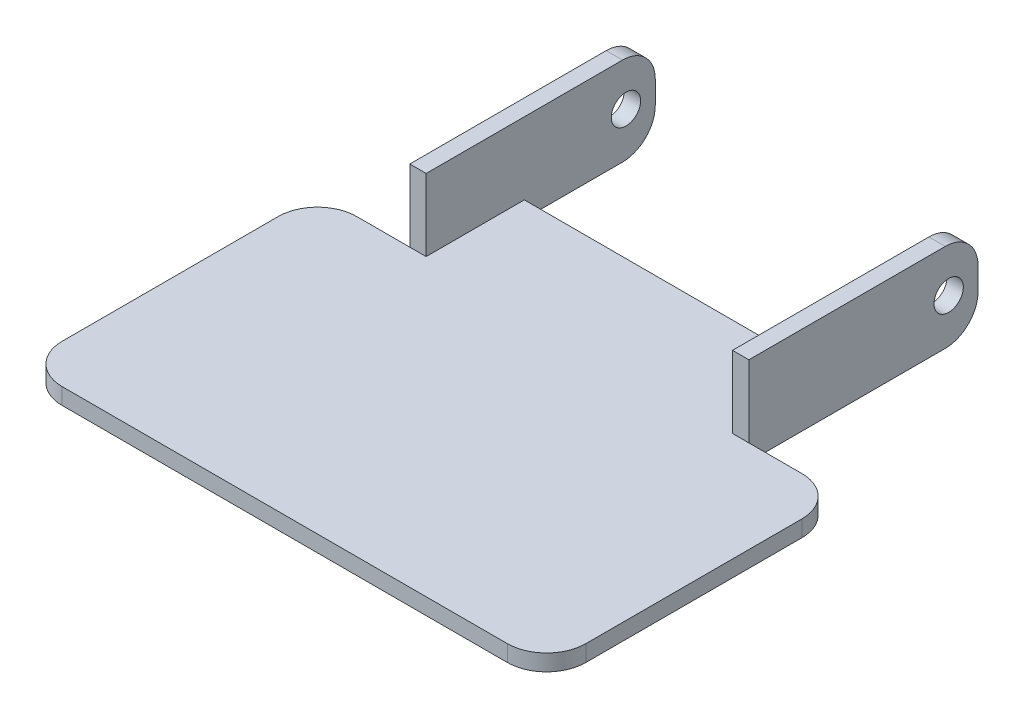
ISO-10303-21;
HEADER;
FILE_DESCRIPTION(('STEP AP214'),'2;1');
FILE_NAME('part.step','',(''),(''),'','','');
FILE_SCHEMA(('AUTOMOTIVE_DESIGN { 1 0 10303 214 1 1 1 1 }'));
ENDSEC;
DATA;
#1=APPLICATION_CONTEXT('core data for automotive mechanical design processes');
#2=APPLICATION_PROTOCOL_DEFINITION('international standard','automotive_design',2000,#1);
#3=PRODUCT_CONTEXT('',#1,'mechanical');
#4=PRODUCT('Part','Part','',(#3));
#5=PRODUCT_RELATED_PRODUCT_CATEGORY('part','',(#4));
#6=PRODUCT_DEFINITION_FORMATION('','',#4);
#7=PRODUCT_DEFINITION_CONTEXT('part definition',#1,'design');
#8=PRODUCT_DEFINITION('design','',#6,#7);
#9=PRODUCT_DEFINITION_SHAPE('','',#8);
#10=(LENGTH_UNIT() NAMED_UNIT(*) SI_UNIT(.MILLI.,.METRE.));
#11=(NAMED_UNIT(*) PLANE_ANGLE_UNIT() SI_UNIT($,.RADIAN.));
#12=(NAMED_UNIT(*) SI_UNIT($,.STERADIAN.) SOLID_ANGLE_UNIT());
#13=UNCERTAINTY_MEASURE_WITH_UNIT(LENGTH_MEASURE(1.E-05),#10,'distance_accuracy_value','');
#14=(GEOMETRIC_REPRESENTATION_CONTEXT(3) GLOBAL_UNCERTAINTY_ASSIGNED_CONTEXT((#13)) GLOBAL_UNIT_ASSIGNED_CONTEXT((#10,
#11,#12)) REPRESENTATION_CONTEXT('',''));
#15=CARTESIAN_POINT('',(0.,0.,0.));
#16=DIRECTION('',(0.,0.,1.));
#17=DIRECTION('',(1.,0.,0.));
#18=AXIS2_PLACEMENT_3D('',#15,#16,#17);
#19=CARTESIAN_POINT('',(0.,1.5875,-28.575));
#20=DIRECTION('',(0.,-1.,0.));
#21=DIRECTION('',(0.,0.,-1.));
#22=AXIS2_PLACEMENT_3D('',#19,#20,#21);
#23=PLANE('',#22);
#24=DIRECTION('',(-1.,0.,0.));
#25=VECTOR('',#24,1.);
#26=CARTESIAN_POINT('',(0.,1.5875,-28.575));
#27=LINE('',#26,#25);
#28=CARTESIAN_POINT('',(8.9535,1.5875,-28.575));
#29=VERTEX_POINT('',#28);
#30=CARTESIAN_POINT('',(3.81,1.5875,-28.575));
#31=VERTEX_POINT('',#30);
#32=EDGE_CURVE('E254',#29,#31,#27,.T.);
#33=ORIENTED_EDGE('',*,*,#32,.T.);
#34=CARTESIAN_POINT('',(3.81,1.5875,-24.765));
#35=DIRECTION('',(0.,-1.,0.));
#36=DIRECTION('',(0.,0.,-1.));
#37=AXIS2_PLACEMENT_3D('',#34,#35,#36);
#38=CIRCLE('',#37,3.81);
#39=CARTESIAN_POINT('',(0.,1.5875,-24.765));
#40=VERTEX_POINT('',#39);
#41=EDGE_CURVE('E319',#31,#40,#38,.F.);
#42=ORIENTED_EDGE('',*,*,#41,.T.);
#43=DIRECTION('',(0.,0.,1.));
#44=VECTOR('',#43,1.);
#45=CARTESIAN_POINT('',(0.,1.5875,0.));
#46=LINE('',#45,#44);
#47=CARTESIAN_POINT('',(0.,1.5875,-3.81));
#48=VERTEX_POINT('',#47);
#49=EDGE_CURVE('E245',#40,#48,#46,.T.);
#50=ORIENTED_EDGE('',*,*,#49,.T.);
#51=CARTESIAN_POINT('',(3.81,1.5875,-3.81));
#52=DIRECTION('',(0.,-1.,0.));
#53=DIRECTION('',(0.,0.,-1.));
#54=AXIS2_PLACEMENT_3D('',#51,#52,#53);
#55=CIRCLE('',#54,3.81);
#56=CARTESIAN_POINT('',(3.81,1.5875,0.));
#57=VERTEX_POINT('',#56);
#58=EDGE_CURVE('E317',#48,#57,#55,.F.);
#59=ORIENTED_EDGE('',*,*,#58,.T.);
#60=DIRECTION('',(1.,0.,0.));
#61=VECTOR('',#60,1.);
#62=CARTESIAN_POINT('',(0.,1.5875,0.));
#63=LINE('',#62,#61);
#64=CARTESIAN_POINT('',(46.99,1.5875,0.));
#65=VERTEX_POINT('',#64);
#66=EDGE_CURVE('E489',#57,#65,#63,.T.);
#67=ORIENTED_EDGE('',*,*,#66,.T.);
#68=CARTESIAN_POINT('',(46.99,1.5875,-3.81));
#69=DIRECTION('',(0.,-1.,0.));
#70=DIRECTION('',(0.,0.,-1.));
#71=AXIS2_PLACEMENT_3D('',#68,#69,#70);
#72=CIRCLE('',#71,3.81);
#73=CARTESIAN_POINT('',(50.8,1.5875,-3.81));
#74=VERTEX_POINT('',#73);
#75=EDGE_CURVE('E315',#65,#74,#72,.F.);
#76=ORIENTED_EDGE('',*,*,#75,.T.);
#77=DIRECTION('',(0.,0.,-1.));
#78=VECTOR('',#77,1.);
#79=CARTESIAN_POINT('',(50.8,1.5875,0.));
#80=LINE('',#79,#78);
#81=CARTESIAN_POINT('',(50.8,1.5875,-24.765));
#82=VERTEX_POINT('',#81);
#83=EDGE_CURVE('E331',#74,#82,#80,.T.);
#84=ORIENTED_EDGE('',*,*,#83,.T.);
#85=CARTESIAN_POINT('',(46.99,1.5875,-24.765));
#86=DIRECTION('',(0.,-1.,0.));
#87=DIRECTION('',(0.,0.,-1.));
#88=AXIS2_PLACEMENT_3D('',#85,#86,#87);
#89=CIRCLE('',#88,3.81);
#90=CARTESIAN_POINT('',(46.99,1.5875,-28.575));
#91=VERTEX_POINT('',#90);
#92=EDGE_CURVE('E48',#82,#91,#89,.F.);
#93=ORIENTED_EDGE('',*,*,#92,.T.);
#94=DIRECTION('',(-1.,0.,0.));
#95=VECTOR('',#94,1.);
#96=CARTESIAN_POINT('',(41.8465,1.5875,-28.575));
#97=LINE('',#96,#95);
#98=CARTESIAN_POINT('',(41.8465,1.5875,-28.575));
#99=VERTEX_POINT('',#98);
#100=EDGE_CURVE('E255',#91,#99,#97,.T.);
#101=ORIENTED_EDGE('',*,*,#100,.T.);
#102=DIRECTION('',(1.,0.,0.));
#103=VECTOR('',#102,1.);
#104=CARTESIAN_POINT('',(41.8465,1.5875,-28.575));
#105=LINE('',#104,#103);
#106=CARTESIAN_POINT('',(40.259,1.5875,-28.575));
#107=VERTEX_POINT('',#106);
#108=EDGE_CURVE('E222',#107,#99,#105,.T.);
#109=ORIENTED_EDGE('',*,*,#108,.F.);
#110=DIRECTION('',(0.,0.,1.));
#111=VECTOR('',#110,1.);
#112=CARTESIAN_POINT('',(40.259,1.5875,-28.575));
#113=LINE('',#112,#111);
#114=CARTESIAN_POINT('',(40.259,1.5875,-38.1));
#115=VERTEX_POINT('',#114);
#116=EDGE_CURVE('E208',#115,#107,#113,.T.);
#117=ORIENTED_EDGE('',*,*,#116,.F.);
#118=DIRECTION('',(-1.,0.,0.));
#119=VECTOR('',#118,1.);
#120=CARTESIAN_POINT('',(10.541,1.5875,-38.1));
#121=LINE('',#120,#119);
#122=CARTESIAN_POINT('',(10.541,1.5875,-38.1));
#123=VERTEX_POINT('',#122);
#124=EDGE_CURVE('E252',#115,#123,#121,.T.);
#125=ORIENTED_EDGE('',*,*,#124,.T.);
#126=DIRECTION('',(0.,0.,-1.));
#127=VECTOR('',#126,1.);
#128=CARTESIAN_POINT('',(10.541,1.5875,-28.575));
#129=LINE('',#128,#127);
#130=CARTESIAN_POINT('',(10.541,1.5875,-28.575));
#131=VERTEX_POINT('',#130);
#132=EDGE_CURVE('E228',#131,#123,#129,.T.);
#133=ORIENTED_EDGE('',*,*,#132,.F.);
#134=DIRECTION('',(1.,0.,0.));
#135=VECTOR('',#134,1.);
#136=CARTESIAN_POINT('',(8.9535,1.5875,-28.575));
#137=LINE('',#136,#135);
#138=EDGE_CURVE('E211',#29,#131,#137,.T.);
#139=ORIENTED_EDGE('',*,*,#138,.F.);
#140=EDGE_LOOP('',(#33,#42,#50,#59,#67,#76,#84,#93,#101,#109,#117,#125,#133,#139));
#141=FACE_BOUND('',#140,.T.);
#142=ADVANCED_FACE('F33',(#141),#23,.F.);
#143=CARTESIAN_POINT('',(0.,1.5875,0.));
#144=DIRECTION('',(1.,0.,0.));
#145=DIRECTION('',(0.,0.,-1.));
#146=AXIS2_PLACEMENT_3D('',#143,#144,#145);
#147=PLANE('',#146);
#148=ORIENTED_EDGE('',*,*,#49,.F.);
#149=DIRECTION('',(0.,-1.,0.));
#150=VECTOR('',#149,1.);
#151=CARTESIAN_POINT('',(0.,1.5875,-24.765));
#152=LINE('',#151,#150);
#153=CARTESIAN_POINT('',(0.,0.,-24.765));
#154=VERTEX_POINT('',#153);
#155=EDGE_CURVE('E301',#40,#154,#152,.T.);
#156=ORIENTED_EDGE('',*,*,#155,.T.);
#157=DIRECTION('',(0.,0.,1.));
#158=VECTOR('',#157,1.);
#159=CARTESIAN_POINT('',(0.,0.,0.));
#160=LINE('',#159,#158);
#161=CARTESIAN_POINT('',(0.,0.,-3.81));
#162=VERTEX_POINT('',#161);
#163=EDGE_CURVE('E241',#154,#162,#160,.T.);
#164=ORIENTED_EDGE('',*,*,#163,.T.);
#165=DIRECTION('',(0.,-1.,0.));
#166=VECTOR('',#165,1.);
#167=CARTESIAN_POINT('',(0.,1.5875,-3.81));
#168=LINE('',#167,#166);
#169=EDGE_CURVE('E299',#162,#48,#168,.F.);
#170=ORIENTED_EDGE('',*,*,#169,.T.);
#171=EDGE_LOOP('',(#148,#156,#164,#170));
#172=FACE_BOUND('',#171,.T.);
#173=ADVANCED_FACE('F410',(#172),#147,.F.);
#174=CARTESIAN_POINT('',(0.,1.5875,0.));
#175=DIRECTION('',(0.,0.,-1.));
#176=DIRECTION('',(-1.,0.,0.));
#177=AXIS2_PLACEMENT_3D('',#174,#175,#176);
#178=PLANE('',#177);
#179=ORIENTED_EDGE('',*,*,#66,.F.);
#180=DIRECTION('',(0.,-1.,0.));
#181=VECTOR('',#180,1.);
#182=CARTESIAN_POINT('',(3.81,1.5875,0.));
#183=LINE('',#182,#181);
#184=CARTESIAN_POINT('',(3.81,0.,0.));
#185=VERTEX_POINT('',#184);
#186=EDGE_CURVE('E323',#57,#185,#183,.T.);
#187=ORIENTED_EDGE('',*,*,#186,.T.);
#188=DIRECTION('',(1.,0.,0.));
#189=VECTOR('',#188,1.);
#190=CARTESIAN_POINT('',(0.,0.,0.));
#191=LINE('',#190,#189);
#192=CARTESIAN_POINT('',(46.99,0.,0.));
#193=VERTEX_POINT('',#192);
#194=EDGE_CURVE('E341',#185,#193,#191,.T.);
#195=ORIENTED_EDGE('',*,*,#194,.T.);
#196=DIRECTION('',(0.,-1.,0.));
#197=VECTOR('',#196,1.);
#198=CARTESIAN_POINT('',(46.99,1.5875,0.));
#199=LINE('',#198,#197);
#200=EDGE_CURVE('E321',#193,#65,#199,.F.);
#201=ORIENTED_EDGE('',*,*,#200,.T.);
#202=EDGE_LOOP('',(#179,#187,#195,#201));
#203=FACE_BOUND('',#202,.T.);
#204=ADVANCED_FACE('F415',(#203),#178,.F.);
#205=CARTESIAN_POINT('',(50.8,1.5875,0.));
#206=DIRECTION('',(-1.,0.,0.));
#207=DIRECTION('',(0.,0.,1.));
#208=AXIS2_PLACEMENT_3D('',#205,#206,#207);
#209=PLANE('',#208);
#210=ORIENTED_EDGE('',*,*,#83,.F.);
#211=DIRECTION('',(0.,-1.,0.));
#212=VECTOR('',#211,1.);
#213=CARTESIAN_POINT('',(50.8,1.5875,-3.81));
#214=LINE('',#213,#212);
#215=CARTESIAN_POINT('',(50.8,0.,-3.81));
#216=VERTEX_POINT('',#215);
#217=EDGE_CURVE('E41',#74,#216,#214,.T.);
#218=ORIENTED_EDGE('',*,*,#217,.T.);
#219=DIRECTION('',(0.,0.,-1.));
#220=VECTOR('',#219,1.);
#221=CARTESIAN_POINT('',(50.8,0.,0.));
#222=LINE('',#221,#220);
#223=CARTESIAN_POINT('',(50.8,0.,-24.765));
#224=VERTEX_POINT('',#223);
#225=EDGE_CURVE('E330',#216,#224,#222,.T.);
#226=ORIENTED_EDGE('',*,*,#225,.T.);
#227=DIRECTION('',(0.,-1.,0.));
#228=VECTOR('',#227,1.);
#229=CARTESIAN_POINT('',(50.8,1.5875,-24.765));
#230=LINE('',#229,#228);
#231=EDGE_CURVE('E56',#224,#82,#230,.F.);
#232=ORIENTED_EDGE('',*,*,#231,.T.);
#233=EDGE_LOOP('',(#210,#218,#226,#232));
#234=FACE_BOUND('',#233,.T.);
#235=ADVANCED_FACE('F329',(#234),#209,.F.);
#236=CARTESIAN_POINT('',(41.8465,1.5875,-28.575));
#237=DIRECTION('',(0.,0.,1.));
#238=DIRECTION('',(1.,0.,0.));
#239=AXIS2_PLACEMENT_3D('',#236,#237,#238);
#240=PLANE('',#239);
#241=ORIENTED_EDGE('',*,*,#100,.F.);
#242=DIRECTION('',(0.,-1.,0.));
#243=VECTOR('',#242,1.);
#244=CARTESIAN_POINT('',(46.99,1.5875,-28.575));
#245=LINE('',#244,#243);
#246=CARTESIAN_POINT('',(46.99,0.,-28.575));
#247=VERTEX_POINT('',#246);
#248=EDGE_CURVE('E11',#91,#247,#245,.T.);
#249=ORIENTED_EDGE('',*,*,#248,.T.);
#250=DIRECTION('',(-1.,0.,0.));
#251=VECTOR('',#250,1.);
#252=CARTESIAN_POINT('',(41.8465,0.,-28.575));
#253=LINE('',#252,#251);
#254=CARTESIAN_POINT('',(41.8465,0.,-28.575));
#255=VERTEX_POINT('',#254);
#256=EDGE_CURVE('E340',#247,#255,#253,.T.);
#257=ORIENTED_EDGE('',*,*,#256,.T.);
#258=DIRECTION('',(0.,-1.,0.));
#259=VECTOR('',#258,1.);
#260=CARTESIAN_POINT('',(41.8465,1.5875,-28.575));
#261=LINE('',#260,#259);
#262=EDGE_CURVE('E250',#99,#255,#261,.T.);
#263=ORIENTED_EDGE('',*,*,#262,.F.);
#264=EDGE_LOOP('',(#241,#249,#257,#263));
#265=FACE_BOUND('',#264,.T.);
#266=ADVANCED_FACE('F406',(#265),#240,.F.);
#267=CARTESIAN_POINT('',(41.8465,1.5875,-50.8));
#268=DIRECTION('',(-1.,0.,0.));
#269=DIRECTION('',(0.,0.,1.));
#270=AXIS2_PLACEMENT_3D('',#267,#268,#269);
#271=PLANE('',#270);
#272=CARTESIAN_POINT('',(41.8465,4.28625,-47.9552));
#273=DIRECTION('',(-1.,0.,0.));
#274=DIRECTION('',(0.,0.,1.));
#275=AXIS2_PLACEMENT_3D('',#272,#273,#274);
#276=CIRCLE('',#275,1.42240000000001);
#277=CARTESIAN_POINT('',(41.8465,4.28625,-46.5328));
#278=VERTEX_POINT('',#277);
#279=EDGE_CURVE('E713',#278,#278,#276,.T.);
#280=ORIENTED_EDGE('',*,*,#279,.T.);
#281=EDGE_LOOP('',(#280));
#282=FACE_BOUND('',#281,.T.);
#283=DIRECTION('',(0.,-1.,0.));
#284=VECTOR('',#283,1.);
#285=CARTESIAN_POINT('',(41.8465,1.5875,-50.8));
#286=LINE('',#285,#284);
#287=CARTESIAN_POINT('',(41.8465,5.3975,-50.8));
#288=VERTEX_POINT('',#287);
#289=CARTESIAN_POINT('',(41.8465,3.175,-50.8));
#290=VERTEX_POINT('',#289);
#291=EDGE_CURVE('E374',#288,#290,#286,.T.);
#292=ORIENTED_EDGE('',*,*,#291,.F.);
#293=CARTESIAN_POINT('',(41.8465,5.3975,-47.625));
#294=DIRECTION('',(-1.,0.,0.));
#295=DIRECTION('',(0.,0.,1.));
#296=AXIS2_PLACEMENT_3D('',#293,#294,#295);
#297=CIRCLE('',#296,3.175);
#298=CARTESIAN_POINT('',(41.8465,8.5725,-47.625));
#299=VERTEX_POINT('',#298);
#300=EDGE_CURVE('E277',#288,#299,#297,.F.);
#301=ORIENTED_EDGE('',*,*,#300,.T.);
#302=DIRECTION('',(0.,0.,-1.));
#303=VECTOR('',#302,1.);
#304=CARTESIAN_POINT('',(41.8465,8.5725,-28.575));
#305=LINE('',#304,#303);
#306=CARTESIAN_POINT('',(41.8465,8.5725,-28.575));
#307=VERTEX_POINT('',#306);
#308=EDGE_CURVE('E200',#307,#299,#305,.T.);
#309=ORIENTED_EDGE('',*,*,#308,.F.);
#310=DIRECTION('',(0.,-1.,0.));
#311=VECTOR('',#310,1.);
#312=CARTESIAN_POINT('',(41.8465,8.5725,-28.575));
#313=LINE('',#312,#311);
#314=EDGE_CURVE('E212',#307,#99,#313,.T.);
#315=ORIENTED_EDGE('',*,*,#314,.T.);
#316=ORIENTED_EDGE('',*,*,#262,.T.);
#317=DIRECTION('',(0.,0.,-1.));
#318=VECTOR('',#317,1.);
#319=CARTESIAN_POINT('',(41.8465,0.,-50.8));
#320=LINE('',#319,#318);
#321=CARTESIAN_POINT('',(41.8465,0.,-47.625));
#322=VERTEX_POINT('',#321);
#323=EDGE_CURVE('E343',#255,#322,#320,.T.);
#324=ORIENTED_EDGE('',*,*,#323,.T.);
#325=CARTESIAN_POINT('',(41.8465,3.175,-47.625));
#326=DIRECTION('',(-1.,0.,0.));
#327=DIRECTION('',(0.,0.,1.));
#328=AXIS2_PLACEMENT_3D('',#325,#326,#327);
#329=CIRCLE('',#328,3.175);
#330=EDGE_CURVE('E275',#322,#290,#329,.F.);
#331=ORIENTED_EDGE('',*,*,#330,.T.);
#332=EDGE_LOOP('',(#292,#301,#309,#315,#316,#324,#331));
#333=FACE_BOUND('',#332,.T.);
#334=ADVANCED_FACE('F383',(#282,#333),#271,.F.);
#335=CARTESIAN_POINT('',(40.259,1.5875,-50.8));
#336=DIRECTION('',(0.,0.,1.));
#337=DIRECTION('',(1.,0.,0.));
#338=AXIS2_PLACEMENT_3D('',#335,#336,#337);
#339=PLANE('',#338);
#340=DIRECTION('',(0.,-1.,0.));
#341=VECTOR('',#340,1.);
#342=CARTESIAN_POINT('',(40.259,1.5875,-50.8));
#343=LINE('',#342,#341);
#344=CARTESIAN_POINT('',(40.259,5.3975,-50.8));
#345=VERTEX_POINT('',#344);
#346=CARTESIAN_POINT('',(40.259,3.175,-50.8));
#347=VERTEX_POINT('',#346);
#348=EDGE_CURVE('E372',#345,#347,#343,.T.);
#349=ORIENTED_EDGE('',*,*,#348,.F.);
#350=DIRECTION('',(-1.,0.,0.));
#351=VECTOR('',#350,1.);
#352=CARTESIAN_POINT('',(41.8465,5.3975,-50.8));
#353=LINE('',#352,#351);
#354=EDGE_CURVE('E273',#345,#288,#353,.F.);
#355=ORIENTED_EDGE('',*,*,#354,.T.);
#356=ORIENTED_EDGE('',*,*,#291,.T.);
#357=DIRECTION('',(-1.,0.,0.));
#358=VECTOR('',#357,1.);
#359=CARTESIAN_POINT('',(40.259,3.175,-50.8));
#360=LINE('',#359,#358);
#361=EDGE_CURVE('E270',#290,#347,#360,.T.);
#362=ORIENTED_EDGE('',*,*,#361,.T.);
#363=EDGE_LOOP('',(#349,#355,#356,#362));
#364=FACE_BOUND('',#363,.T.);
#365=ADVANCED_FACE('F396',(#364),#339,.F.);
#366=CARTESIAN_POINT('',(40.259,1.5875,-38.1));
#367=DIRECTION('',(1.,0.,0.));
#368=DIRECTION('',(0.,0.,-1.));
#369=AXIS2_PLACEMENT_3D('',#366,#367,#368);
#370=PLANE('',#369);
#371=CARTESIAN_POINT('',(40.259,4.28625,-47.9552));
#372=DIRECTION('',(1.,0.,0.));
#373=DIRECTION('',(0.,0.,-1.));
#374=AXIS2_PLACEMENT_3D('',#371,#372,#373);
#375=CIRCLE('',#374,1.42240000000001);
#376=CARTESIAN_POINT('',(40.259,4.28625,-49.3776));
#377=VERTEX_POINT('',#376);
#378=EDGE_CURVE('E223',#377,#377,#375,.T.);
#379=ORIENTED_EDGE('',*,*,#378,.T.);
#380=EDGE_LOOP('',(#379));
#381=FACE_BOUND('',#380,.T.);
#382=DIRECTION('',(0.,0.,1.));
#383=VECTOR('',#382,1.);
#384=CARTESIAN_POINT('',(40.259,8.5725,-28.575));
#385=LINE('',#384,#383);
#386=CARTESIAN_POINT('',(40.259,8.5725,-47.625));
#387=VERTEX_POINT('',#386);
#388=CARTESIAN_POINT('',(40.259,8.5725,-28.575));
#389=VERTEX_POINT('',#388);
#390=EDGE_CURVE('E190',#387,#389,#385,.T.);
#391=ORIENTED_EDGE('',*,*,#390,.F.);
#392=CARTESIAN_POINT('',(40.259,5.3975,-47.625));
#393=DIRECTION('',(1.,0.,0.));
#394=DIRECTION('',(0.,0.,-1.));
#395=AXIS2_PLACEMENT_3D('',#392,#393,#394);
#396=CIRCLE('',#395,3.175);
#397=EDGE_CURVE('E268',#387,#345,#396,.F.);
#398=ORIENTED_EDGE('',*,*,#397,.T.);
#399=ORIENTED_EDGE('',*,*,#348,.T.);
#400=CARTESIAN_POINT('',(40.259,3.175,-47.625));
#401=DIRECTION('',(1.,0.,0.));
#402=DIRECTION('',(0.,0.,-1.));
#403=AXIS2_PLACEMENT_3D('',#400,#401,#402);
#404=CIRCLE('',#403,3.175);
#405=CARTESIAN_POINT('',(40.259,0.,-47.625));
#406=VERTEX_POINT('',#405);
#407=EDGE_CURVE('E266',#347,#406,#404,.F.);
#408=ORIENTED_EDGE('',*,*,#407,.T.);
#409=DIRECTION('',(0.,0.,1.));
#410=VECTOR('',#409,1.);
#411=CARTESIAN_POINT('',(40.259,0.,-38.1));
#412=LINE('',#411,#410);
#413=CARTESIAN_POINT('',(40.259,0.,-38.1));
#414=VERTEX_POINT('',#413);
#415=EDGE_CURVE('E350',#406,#414,#412,.T.);
#416=ORIENTED_EDGE('',*,*,#415,.T.);
#417=DIRECTION('',(0.,-1.,0.));
#418=VECTOR('',#417,1.);
#419=CARTESIAN_POINT('',(40.259,1.5875,-38.1));
#420=LINE('',#419,#418);
#421=EDGE_CURVE('E261',#115,#414,#420,.T.);
#422=ORIENTED_EDGE('',*,*,#421,.F.);
#423=ORIENTED_EDGE('',*,*,#116,.T.);
#424=DIRECTION('',(0.,-1.,0.));
#425=VECTOR('',#424,1.);
#426=CARTESIAN_POINT('',(40.259,8.5725,-28.575));
#427=LINE('',#426,#425);
#428=EDGE_CURVE('E204',#389,#107,#427,.T.);
#429=ORIENTED_EDGE('',*,*,#428,.F.);
#430=EDGE_LOOP('',(#391,#398,#399,#408,#416,#422,#423,#429));
#431=FACE_BOUND('',#430,.T.);
#432=ADVANCED_FACE('F205',(#381,#431),#370,.F.);
#433=CARTESIAN_POINT('',(10.541,1.5875,-38.1));
#434=DIRECTION('',(0.,0.,1.));
#435=DIRECTION('',(1.,0.,0.));
#436=AXIS2_PLACEMENT_3D('',#433,#434,#435);
#437=PLANE('',#436);
#438=DIRECTION('',(-1.,0.,0.));
#439=VECTOR('',#438,1.);
#440=CARTESIAN_POINT('',(10.541,0.,-38.1));
#441=LINE('',#440,#439);
#442=CARTESIAN_POINT('',(10.541,0.,-38.1));
#443=VERTEX_POINT('',#442);
#444=EDGE_CURVE('E352',#414,#443,#441,.T.);
#445=ORIENTED_EDGE('',*,*,#444,.T.);
#446=DIRECTION('',(0.,-1.,0.));
#447=VECTOR('',#446,1.);
#448=CARTESIAN_POINT('',(10.541,1.5875,-38.1));
#449=LINE('',#448,#447);
#450=EDGE_CURVE('E258',#123,#443,#449,.T.);
#451=ORIENTED_EDGE('',*,*,#450,.F.);
#452=ORIENTED_EDGE('',*,*,#124,.F.);
#453=ORIENTED_EDGE('',*,*,#421,.T.);
#454=EDGE_LOOP('',(#445,#451,#452,#453));
#455=FACE_BOUND('',#454,.T.);
#456=ADVANCED_FACE('F403',(#455),#437,.F.);
#457=CARTESIAN_POINT('',(10.541,1.5875,-50.8));
#458=DIRECTION('',(-1.,0.,0.));
#459=DIRECTION('',(0.,0.,1.));
#460=AXIS2_PLACEMENT_3D('',#457,#458,#459);
#461=PLANE('',#460);
#462=CARTESIAN_POINT('',(10.541,4.28625,-47.9552));
#463=DIRECTION('',(-1.,0.,0.));
#464=DIRECTION('',(0.,0.,1.));
#465=AXIS2_PLACEMENT_3D('',#462,#463,#464);
#466=CIRCLE('',#465,1.42240000000001);
#467=CARTESIAN_POINT('',(10.541,4.28625,-46.5328));
#468=VERTEX_POINT('',#467);
#469=EDGE_CURVE('E717',#468,#468,#466,.T.);
#470=ORIENTED_EDGE('',*,*,#469,.T.);
#471=EDGE_LOOP('',(#470));
#472=FACE_BOUND('',#471,.T.);
#473=DIRECTION('',(0.,-1.,0.));
#474=VECTOR('',#473,1.);
#475=CARTESIAN_POINT('',(10.541,1.5875,-50.8));
#476=LINE('',#475,#474);
#477=CARTESIAN_POINT('',(10.541,5.3975,-50.8));
#478=VERTEX_POINT('',#477);
#479=CARTESIAN_POINT('',(10.541,3.175,-50.8));
#480=VERTEX_POINT('',#479);
#481=EDGE_CURVE('E262',#478,#480,#476,.T.);
#482=ORIENTED_EDGE('',*,*,#481,.F.);
#483=CARTESIAN_POINT('',(10.541,5.3975,-47.625));
#484=DIRECTION('',(-1.,0.,0.));
#485=DIRECTION('',(0.,0.,1.));
#486=AXIS2_PLACEMENT_3D('',#483,#484,#485);
#487=CIRCLE('',#486,3.175);
#488=CARTESIAN_POINT('',(10.541,8.5725,-47.625));
#489=VERTEX_POINT('',#488);
#490=EDGE_CURVE('E297',#478,#489,#487,.F.);
#491=ORIENTED_EDGE('',*,*,#490,.T.);
#492=DIRECTION('',(0.,0.,-1.));
#493=VECTOR('',#492,1.);
#494=CARTESIAN_POINT('',(10.541,8.5725,-28.575));
#495=LINE('',#494,#493);
#496=CARTESIAN_POINT('',(10.541,8.5725,-28.575));
#497=VERTEX_POINT('',#496);
#498=EDGE_CURVE('E230',#497,#489,#495,.T.);
#499=ORIENTED_EDGE('',*,*,#498,.F.);
#500=DIRECTION('',(0.,-1.,0.));
#501=VECTOR('',#500,1.);
#502=CARTESIAN_POINT('',(10.541,8.5725,-28.575));
#503=LINE('',#502,#501);
#504=EDGE_CURVE('E233',#497,#131,#503,.T.);
#505=ORIENTED_EDGE('',*,*,#504,.T.);
#506=ORIENTED_EDGE('',*,*,#132,.T.);
#507=ORIENTED_EDGE('',*,*,#450,.T.);
#508=DIRECTION('',(0.,0.,-1.));
#509=VECTOR('',#508,1.);
#510=CARTESIAN_POINT('',(10.541,0.,-50.8));
#511=LINE('',#510,#509);
#512=CARTESIAN_POINT('',(10.541,0.,-47.625));
#513=VERTEX_POINT('',#512);
#514=EDGE_CURVE('E354',#443,#513,#511,.T.);
#515=ORIENTED_EDGE('',*,*,#514,.T.);
#516=CARTESIAN_POINT('',(10.541,3.175,-47.625));
#517=DIRECTION('',(-1.,0.,0.));
#518=DIRECTION('',(0.,0.,1.));
#519=AXIS2_PLACEMENT_3D('',#516,#517,#518);
#520=CIRCLE('',#519,3.175);
#521=EDGE_CURVE('E295',#513,#480,#520,.F.);
#522=ORIENTED_EDGE('',*,*,#521,.T.);
#523=EDGE_LOOP('',(#482,#491,#499,#505,#506,#507,#515,#522));
#524=FACE_BOUND('',#523,.T.);
#525=ADVANCED_FACE('F436',(#472,#524),#461,.F.);
#526=CARTESIAN_POINT('',(8.9535,1.5875,-50.8));
#527=DIRECTION('',(0.,0.,1.));
#528=DIRECTION('',(1.,0.,0.));
#529=AXIS2_PLACEMENT_3D('',#526,#527,#528);
#530=PLANE('',#529);
#531=DIRECTION('',(0.,-1.,0.));
#532=VECTOR('',#531,1.);
#533=CARTESIAN_POINT('',(8.9535,1.5875,-50.8));
#534=LINE('',#533,#532);
#535=CARTESIAN_POINT('',(8.9535,5.3975,-50.8));
#536=VERTEX_POINT('',#535);
#537=CARTESIAN_POINT('',(8.9535,3.175,-50.8));
#538=VERTEX_POINT('',#537);
#539=EDGE_CURVE('E365',#536,#538,#534,.T.);
#540=ORIENTED_EDGE('',*,*,#539,.F.);
#541=DIRECTION('',(-1.,0.,0.));
#542=VECTOR('',#541,1.);
#543=CARTESIAN_POINT('',(8.9535,5.3975,-50.8));
#544=LINE('',#543,#542);
#545=EDGE_CURVE('E293',#536,#478,#544,.F.);
#546=ORIENTED_EDGE('',*,*,#545,.T.);
#547=ORIENTED_EDGE('',*,*,#481,.T.);
#548=DIRECTION('',(-1.,0.,0.));
#549=VECTOR('',#548,1.);
#550=CARTESIAN_POINT('',(8.9535,3.175,-50.8));
#551=LINE('',#550,#549);
#552=EDGE_CURVE('E290',#480,#538,#551,.T.);
#553=ORIENTED_EDGE('',*,*,#552,.T.);
#554=EDGE_LOOP('',(#540,#546,#547,#553));
#555=FACE_BOUND('',#554,.T.);
#556=ADVANCED_FACE('F432',(#555),#530,.F.);
#557=CARTESIAN_POINT('',(8.9535,1.5875,-28.575));
#558=DIRECTION('',(1.,0.,0.));
#559=DIRECTION('',(0.,0.,-1.));
#560=AXIS2_PLACEMENT_3D('',#557,#558,#559);
#561=PLANE('',#560);
#562=CARTESIAN_POINT('',(8.9535,4.28625,-47.9552));
#563=DIRECTION('',(-1.,0.,0.));
#564=DIRECTION('',(0.,0.,1.));
#565=AXIS2_PLACEMENT_3D('',#562,#563,#564);
#566=CIRCLE('',#565,1.42240000000001);
#567=CARTESIAN_POINT('',(8.9535,4.28625,-46.5328));
#568=VERTEX_POINT('',#567);
#569=EDGE_CURVE('E722',#568,#568,#566,.T.);
#570=ORIENTED_EDGE('',*,*,#569,.F.);
#571=EDGE_LOOP('',(#570));
#572=FACE_BOUND('',#571,.T.);
#573=DIRECTION('',(0.,0.,1.));
#574=VECTOR('',#573,1.);
#575=CARTESIAN_POINT('',(8.9535,8.5725,-28.575));
#576=LINE('',#575,#574);
#577=CARTESIAN_POINT('',(8.9535,8.5725,-47.625));
#578=VERTEX_POINT('',#577);
#579=CARTESIAN_POINT('',(8.9535,8.5725,-28.575));
#580=VERTEX_POINT('',#579);
#581=EDGE_CURVE('E225',#578,#580,#576,.T.);
#582=ORIENTED_EDGE('',*,*,#581,.F.);
#583=CARTESIAN_POINT('',(8.9535,5.3975,-47.625));
#584=DIRECTION('',(1.,0.,0.));
#585=DIRECTION('',(0.,0.,-1.));
#586=AXIS2_PLACEMENT_3D('',#583,#584,#585);
#587=CIRCLE('',#586,3.175);
#588=EDGE_CURVE('E288',#578,#536,#587,.F.);
#589=ORIENTED_EDGE('',*,*,#588,.T.);
#590=ORIENTED_EDGE('',*,*,#539,.T.);
#591=CARTESIAN_POINT('',(8.9535,3.175,-47.625));
#592=DIRECTION('',(1.,0.,0.));
#593=DIRECTION('',(0.,0.,-1.));
#594=AXIS2_PLACEMENT_3D('',#591,#592,#593);
#595=CIRCLE('',#594,3.175);
#596=CARTESIAN_POINT('',(8.9535,0.,-47.625));
#597=VERTEX_POINT('',#596);
#598=EDGE_CURVE('E286',#538,#597,#595,.F.);
#599=ORIENTED_EDGE('',*,*,#598,.T.);
#600=DIRECTION('',(0.,0.,1.));
#601=VECTOR('',#600,1.);
#602=CARTESIAN_POINT('',(8.9535,0.,-28.575));
#603=LINE('',#602,#601);
#604=CARTESIAN_POINT('',(8.9535,0.,-28.575));
#605=VERTEX_POINT('',#604);
#606=EDGE_CURVE('E357',#597,#605,#603,.T.);
#607=ORIENTED_EDGE('',*,*,#606,.T.);
#608=DIRECTION('',(0.,-1.,0.));
#609=VECTOR('',#608,1.);
#610=CARTESIAN_POINT('',(8.9535,1.5875,-28.575));
#611=LINE('',#610,#609);
#612=EDGE_CURVE('E362',#29,#605,#611,.T.);
#613=ORIENTED_EDGE('',*,*,#612,.F.);
#614=DIRECTION('',(0.,-1.,0.));
#615=VECTOR('',#614,1.);
#616=CARTESIAN_POINT('',(8.9535,8.5725,-28.575));
#617=LINE('',#616,#615);
#618=EDGE_CURVE('E238',#580,#29,#617,.T.);
#619=ORIENTED_EDGE('',*,*,#618,.F.);
#620=EDGE_LOOP('',(#582,#589,#590,#599,#607,#613,#619));
#621=FACE_BOUND('',#620,.T.);
#622=ADVANCED_FACE('F428',(#572,#621),#561,.F.);
#623=CARTESIAN_POINT('',(0.,1.5875,-28.575));
#624=DIRECTION('',(0.,0.,1.));
#625=DIRECTION('',(1.,0.,0.));
#626=AXIS2_PLACEMENT_3D('',#623,#624,#625);
#627=PLANE('',#626);
#628=DIRECTION('',(-1.,0.,0.));
#629=VECTOR('',#628,1.);
#630=CARTESIAN_POINT('',(0.,0.,-28.575));
#631=LINE('',#630,#629);
#632=CARTESIAN_POINT('',(3.81,0.,-28.575));
#633=VERTEX_POINT('',#632);
#634=EDGE_CURVE('E359',#605,#633,#631,.T.);
#635=ORIENTED_EDGE('',*,*,#634,.T.);
#636=DIRECTION('',(0.,-1.,0.));
#637=VECTOR('',#636,1.);
#638=CARTESIAN_POINT('',(3.81,1.5875,-28.575));
#639=LINE('',#638,#637);
#640=EDGE_CURVE('E312',#633,#31,#639,.F.);
#641=ORIENTED_EDGE('',*,*,#640,.T.);
#642=ORIENTED_EDGE('',*,*,#32,.F.);
#643=ORIENTED_EDGE('',*,*,#612,.T.);
#644=EDGE_LOOP('',(#635,#641,#642,#643));
#645=FACE_BOUND('',#644,.T.);
#646=ADVANCED_FACE('F425',(#645),#627,.F.);
#647=CARTESIAN_POINT('',(0.,0.,-28.575));
#648=DIRECTION('',(0.,-1.,0.));
#649=DIRECTION('',(0.,0.,-1.));
#650=AXIS2_PLACEMENT_3D('',#647,#648,#649);
#651=PLANE('',#650);
#652=ORIENTED_EDGE('',*,*,#163,.F.);
#653=CARTESIAN_POINT('',(3.81,0.,-24.765));
#654=DIRECTION('',(0.,-1.,0.));
#655=DIRECTION('',(0.,0.,-1.));
#656=AXIS2_PLACEMENT_3D('',#653,#654,#655);
#657=CIRCLE('',#656,3.81);
#658=EDGE_CURVE('E310',#154,#633,#657,.T.);
#659=ORIENTED_EDGE('',*,*,#658,.T.);
#660=ORIENTED_EDGE('',*,*,#634,.F.);
#661=ORIENTED_EDGE('',*,*,#606,.F.);
#662=DIRECTION('',(-1.,0.,0.));
#663=VECTOR('',#662,1.);
#664=CARTESIAN_POINT('',(10.541,0.,-47.625));
#665=LINE('',#664,#663);
#666=EDGE_CURVE('E279',#597,#513,#665,.F.);
#667=ORIENTED_EDGE('',*,*,#666,.T.);
#668=ORIENTED_EDGE('',*,*,#514,.F.);
#669=ORIENTED_EDGE('',*,*,#444,.F.);
#670=ORIENTED_EDGE('',*,*,#415,.F.);
#671=DIRECTION('',(-1.,0.,0.));
#672=VECTOR('',#671,1.);
#673=CARTESIAN_POINT('',(41.8465,0.,-47.625));
#674=LINE('',#673,#672);
#675=EDGE_CURVE('E281',#406,#322,#674,.F.);
#676=ORIENTED_EDGE('',*,*,#675,.T.);
#677=ORIENTED_EDGE('',*,*,#323,.F.);
#678=ORIENTED_EDGE('',*,*,#256,.F.);
#679=CARTESIAN_POINT('',(46.99,0.,-24.765));
#680=DIRECTION('',(0.,-1.,0.));
#681=DIRECTION('',(0.,0.,-1.));
#682=AXIS2_PLACEMENT_3D('',#679,#680,#681);
#683=CIRCLE('',#682,3.81);
#684=EDGE_CURVE('E304',#247,#224,#683,.T.);
#685=ORIENTED_EDGE('',*,*,#684,.T.);
#686=ORIENTED_EDGE('',*,*,#225,.F.);
#687=CARTESIAN_POINT('',(46.99,0.,-3.81));
#688=DIRECTION('',(0.,-1.,0.));
#689=DIRECTION('',(0.,0.,-1.));
#690=AXIS2_PLACEMENT_3D('',#687,#688,#689);
#691=CIRCLE('',#690,3.81);
#692=EDGE_CURVE('E306',#216,#193,#691,.T.);
#693=ORIENTED_EDGE('',*,*,#692,.T.);
#694=ORIENTED_EDGE('',*,*,#194,.F.);
#695=CARTESIAN_POINT('',(3.81,0.,-3.81));
#696=DIRECTION('',(0.,-1.,0.));
#697=DIRECTION('',(0.,0.,-1.));
#698=AXIS2_PLACEMENT_3D('',#695,#696,#697);
#699=CIRCLE('',#698,3.81);
#700=EDGE_CURVE('E308',#185,#162,#699,.T.);
#701=ORIENTED_EDGE('',*,*,#700,.T.);
#702=EDGE_LOOP('',(#652,#659,#660,#661,#667,#668,#669,#670,#676,#677,#678,#685,#686,#693,#694,#701));
#703=FACE_BOUND('',#702,.T.);
#704=ADVANCED_FACE('F336',(#703),#651,.T.);
#705=CARTESIAN_POINT('',(8.9535,8.5725,-28.575));
#706=DIRECTION('',(0.,0.,-1.));
#707=DIRECTION('',(-1.,0.,0.));
#708=AXIS2_PLACEMENT_3D('',#705,#706,#707);
#709=PLANE('',#708);
#710=ORIENTED_EDGE('',*,*,#138,.T.);
#711=ORIENTED_EDGE('',*,*,#504,.F.);
#712=DIRECTION('',(1.,0.,0.));
#713=VECTOR('',#712,1.);
#714=CARTESIAN_POINT('',(8.9535,8.5725,-28.575));
#715=LINE('',#714,#713);
#716=EDGE_CURVE('E227',#580,#497,#715,.T.);
#717=ORIENTED_EDGE('',*,*,#716,.F.);
#718=ORIENTED_EDGE('',*,*,#618,.T.);
#719=EDGE_LOOP('',(#710,#711,#717,#718));
#720=FACE_BOUND('',#719,.T.);
#721=ADVANCED_FACE('F421',(#720),#709,.F.);
#722=CARTESIAN_POINT('',(8.9535,8.5725,-50.8));
#723=DIRECTION('',(0.,-1.,0.));
#724=DIRECTION('',(0.,0.,-1.));
#725=AXIS2_PLACEMENT_3D('',#722,#723,#724);
#726=PLANE('',#725);
#727=ORIENTED_EDGE('',*,*,#498,.T.);
#728=DIRECTION('',(-1.,0.,0.));
#729=VECTOR('',#728,1.);
#730=CARTESIAN_POINT('',(8.9535,8.5725,-47.625));
#731=LINE('',#730,#729);
#732=EDGE_CURVE('E283',#489,#578,#731,.T.);
#733=ORIENTED_EDGE('',*,*,#732,.T.);
#734=ORIENTED_EDGE('',*,*,#581,.T.);
#735=ORIENTED_EDGE('',*,*,#716,.T.);
#736=EDGE_LOOP('',(#727,#733,#734,#735));
#737=FACE_BOUND('',#736,.T.);
#738=ADVANCED_FACE('F464',(#737),#726,.F.);
#739=CARTESIAN_POINT('',(41.8465,8.5725,-28.575));
#740=DIRECTION('',(0.,0.,-1.));
#741=DIRECTION('',(-1.,0.,0.));
#742=AXIS2_PLACEMENT_3D('',#739,#740,#741);
#743=PLANE('',#742);
#744=ORIENTED_EDGE('',*,*,#108,.T.);
#745=ORIENTED_EDGE('',*,*,#314,.F.);
#746=DIRECTION('',(1.,0.,0.));
#747=VECTOR('',#746,1.);
#748=CARTESIAN_POINT('',(41.8465,8.5725,-28.575));
#749=LINE('',#748,#747);
#750=EDGE_CURVE('E195',#389,#307,#749,.T.);
#751=ORIENTED_EDGE('',*,*,#750,.F.);
#752=ORIENTED_EDGE('',*,*,#428,.T.);
#753=EDGE_LOOP('',(#744,#745,#751,#752));
#754=FACE_BOUND('',#753,.T.);
#755=ADVANCED_FACE('F214',(#754),#743,.F.);
#756=CARTESIAN_POINT('',(41.8465,8.5725,-50.8));
#757=DIRECTION('',(0.,1.,0.));
#758=DIRECTION('',(0.,0.,1.));
#759=AXIS2_PLACEMENT_3D('',#756,#757,#758);
#760=PLANE('',#759);
#761=ORIENTED_EDGE('',*,*,#308,.T.);
#762=DIRECTION('',(-1.,0.,0.));
#763=VECTOR('',#762,1.);
#764=CARTESIAN_POINT('',(40.259,8.5725,-47.625));
#765=LINE('',#764,#763);
#766=EDGE_CURVE('E198',#299,#387,#765,.T.);
#767=ORIENTED_EDGE('',*,*,#766,.T.);
#768=ORIENTED_EDGE('',*,*,#390,.T.);
#769=ORIENTED_EDGE('',*,*,#750,.T.);
#770=EDGE_LOOP('',(#761,#767,#768,#769));
#771=FACE_BOUND('',#770,.T.);
#772=ADVANCED_FACE('F193',(#771),#760,.T.);
#773=CARTESIAN_POINT('',(41.8465,5.3975,-47.625));
#774=DIRECTION('',(1.,0.,0.));
#775=DIRECTION('',(0.,0.,-1.));
#776=AXIS2_PLACEMENT_3D('',#773,#774,#775);
#777=CYLINDRICAL_SURFACE('',#776,3.175);
#778=ORIENTED_EDGE('',*,*,#300,.F.);
#779=ORIENTED_EDGE('',*,*,#354,.F.);
#780=ORIENTED_EDGE('',*,*,#397,.F.);
#781=ORIENTED_EDGE('',*,*,#766,.F.);
#782=EDGE_LOOP('',(#778,#779,#780,#781));
#783=FACE_BOUND('',#782,.T.);
#784=ADVANCED_FACE('F394',(#783),#777,.T.);
#785=CARTESIAN_POINT('',(40.259,3.175,-47.625));
#786=DIRECTION('',(1.,0.,0.));
#787=DIRECTION('',(0.,0.,-1.));
#788=AXIS2_PLACEMENT_3D('',#785,#786,#787);
#789=CYLINDRICAL_SURFACE('',#788,3.175);
#790=ORIENTED_EDGE('',*,*,#330,.F.);
#791=ORIENTED_EDGE('',*,*,#675,.F.);
#792=ORIENTED_EDGE('',*,*,#407,.F.);
#793=ORIENTED_EDGE('',*,*,#361,.F.);
#794=EDGE_LOOP('',(#790,#791,#792,#793));
#795=FACE_BOUND('',#794,.T.);
#796=ADVANCED_FACE('F390',(#795),#789,.T.);
#797=CARTESIAN_POINT('',(8.9535,5.3975,-47.625));
#798=DIRECTION('',(-1.,0.,0.));
#799=DIRECTION('',(0.,0.,1.));
#800=AXIS2_PLACEMENT_3D('',#797,#798,#799);
#801=CYLINDRICAL_SURFACE('',#800,3.175);
#802=ORIENTED_EDGE('',*,*,#490,.F.);
#803=ORIENTED_EDGE('',*,*,#545,.F.);
#804=ORIENTED_EDGE('',*,*,#588,.F.);
#805=ORIENTED_EDGE('',*,*,#732,.F.);
#806=EDGE_LOOP('',(#802,#803,#804,#805));
#807=FACE_BOUND('',#806,.T.);
#808=ADVANCED_FACE('F460',(#807),#801,.T.);
#809=CARTESIAN_POINT('',(8.9535,3.175,-47.625));
#810=DIRECTION('',(1.,0.,0.));
#811=DIRECTION('',(0.,0.,-1.));
#812=AXIS2_PLACEMENT_3D('',#809,#810,#811);
#813=CYLINDRICAL_SURFACE('',#812,3.175);
#814=ORIENTED_EDGE('',*,*,#521,.F.);
#815=ORIENTED_EDGE('',*,*,#666,.F.);
#816=ORIENTED_EDGE('',*,*,#598,.F.);
#817=ORIENTED_EDGE('',*,*,#552,.F.);
#818=EDGE_LOOP('',(#814,#815,#816,#817));
#819=FACE_BOUND('',#818,.T.);
#820=ADVANCED_FACE('F454',(#819),#813,.T.);
#821=CARTESIAN_POINT('',(3.81,1.5875,-24.765));
#822=DIRECTION('',(0.,-1.,0.));
#823=DIRECTION('',(0.,0.,-1.));
#824=AXIS2_PLACEMENT_3D('',#821,#822,#823);
#825=CYLINDRICAL_SURFACE('',#824,3.81);
#826=ORIENTED_EDGE('',*,*,#41,.F.);
#827=ORIENTED_EDGE('',*,*,#640,.F.);
#828=ORIENTED_EDGE('',*,*,#658,.F.);
#829=ORIENTED_EDGE('',*,*,#155,.F.);
#830=EDGE_LOOP('',(#826,#827,#828,#829));
#831=FACE_BOUND('',#830,.T.);
#832=ADVANCED_FACE('F507',(#831),#825,.T.);
#833=CARTESIAN_POINT('',(3.81,1.5875,-3.81));
#834=DIRECTION('',(0.,-1.,0.));
#835=DIRECTION('',(0.,0.,-1.));
#836=AXIS2_PLACEMENT_3D('',#833,#834,#835);
#837=CYLINDRICAL_SURFACE('',#836,3.81);
#838=ORIENTED_EDGE('',*,*,#58,.F.);
#839=ORIENTED_EDGE('',*,*,#169,.F.);
#840=ORIENTED_EDGE('',*,*,#700,.F.);
#841=ORIENTED_EDGE('',*,*,#186,.F.);
#842=EDGE_LOOP('',(#838,#839,#840,#841));
#843=FACE_BOUND('',#842,.T.);
#844=ADVANCED_FACE('F485',(#843),#837,.T.);
#845=CARTESIAN_POINT('',(46.99,1.5875,-3.81));
#846=DIRECTION('',(0.,-1.,0.));
#847=DIRECTION('',(0.,0.,-1.));
#848=AXIS2_PLACEMENT_3D('',#845,#846,#847);
#849=CYLINDRICAL_SURFACE('',#848,3.81);
#850=ORIENTED_EDGE('',*,*,#75,.F.);
#851=ORIENTED_EDGE('',*,*,#200,.F.);
#852=ORIENTED_EDGE('',*,*,#692,.F.);
#853=ORIENTED_EDGE('',*,*,#217,.F.);
#854=EDGE_LOOP('',(#850,#851,#852,#853));
#855=FACE_BOUND('',#854,.T.);
#856=ADVANCED_FACE('F496',(#855),#849,.T.);
#857=CARTESIAN_POINT('',(46.99,1.5875,-24.765));
#858=DIRECTION('',(0.,-1.,0.));
#859=DIRECTION('',(0.,0.,-1.));
#860=AXIS2_PLACEMENT_3D('',#857,#858,#859);
#861=CYLINDRICAL_SURFACE('',#860,3.81);
#862=ORIENTED_EDGE('',*,*,#92,.F.);
#863=ORIENTED_EDGE('',*,*,#231,.F.);
#864=ORIENTED_EDGE('',*,*,#684,.F.);
#865=ORIENTED_EDGE('',*,*,#248,.F.);
#866=EDGE_LOOP('',(#862,#863,#864,#865));
#867=FACE_BOUND('',#866,.T.);
#868=ADVANCED_FACE('F35',(#867),#861,.T.);
#869=CARTESIAN_POINT('',(8.9535,4.28625,-47.9552));
#870=DIRECTION('',(-1.,0.,0.));
#871=DIRECTION('',(0.,0.,1.));
#872=AXIS2_PLACEMENT_3D('',#869,#870,#871);
#873=CYLINDRICAL_SURFACE('',#872,1.42240000000001);
#874=ORIENTED_EDGE('',*,*,#569,.T.);
#875=EDGE_LOOP('',(#874));
#876=FACE_BOUND('',#875,.T.);
#877=ORIENTED_EDGE('',*,*,#469,.F.);
#878=EDGE_LOOP('',(#877));
#879=FACE_BOUND('',#878,.T.);
#880=ADVANCED_FACE('F495',(#876,#879),#873,.F.);
#881=ORIENTED_EDGE('',*,*,#279,.F.);
#882=EDGE_LOOP('',(#881));
#883=FACE_BOUND('',#882,.T.);
#884=ORIENTED_EDGE('',*,*,#378,.F.);
#885=EDGE_LOOP('',(#884));
#886=FACE_BOUND('',#885,.T.);
#887=ADVANCED_FACE('F501',(#883,#886),#873,.F.);
#888=CLOSED_SHELL('',(#142,#173,#204,#235,#266,#334,#365,#432,#456,#525,#556,#622,#646,#704,
#721,#738,#755,#772,#784,#796,#808,#820,#832,#844,#856,#868,#880,#887));
#889=MANIFOLD_SOLID_BREP('B2',#888);
#890=ADVANCED_BREP_SHAPE_REPRESENTATION('',(#18,#889),#14);
#891=SHAPE_DEFINITION_REPRESENTATION(#9,#890);
ENDSEC;
END-ISO-10303-21;
